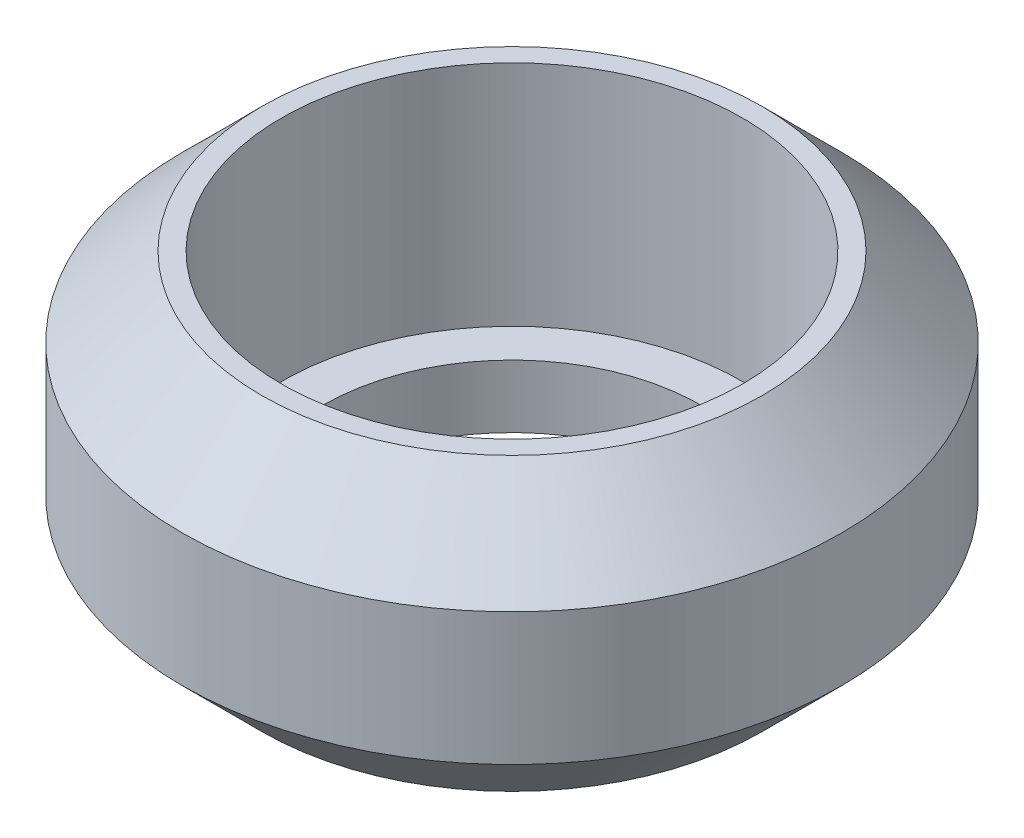
ISO-10303-21;
HEADER;
FILE_DESCRIPTION(('STEP AP214'),'2;1');
FILE_NAME('part.step','',(''),(''),'','','');
FILE_SCHEMA(('AUTOMOTIVE_DESIGN { 1 0 10303 214 1 1 1 1 }'));
ENDSEC;
DATA;
#1=APPLICATION_CONTEXT('core data for automotive mechanical design processes');
#2=APPLICATION_PROTOCOL_DEFINITION('international standard','automotive_design',2000,#1);
#3=PRODUCT_CONTEXT('',#1,'mechanical');
#4=PRODUCT('Part','Part','',(#3));
#5=PRODUCT_RELATED_PRODUCT_CATEGORY('part','',(#4));
#6=PRODUCT_DEFINITION_FORMATION('','',#4);
#7=PRODUCT_DEFINITION_CONTEXT('part definition',#1,'design');
#8=PRODUCT_DEFINITION('design','',#6,#7);
#9=PRODUCT_DEFINITION_SHAPE('','',#8);
#10=(LENGTH_UNIT() NAMED_UNIT(*) SI_UNIT(.MILLI.,.METRE.));
#11=(NAMED_UNIT(*) PLANE_ANGLE_UNIT() SI_UNIT($,.RADIAN.));
#12=(NAMED_UNIT(*) SI_UNIT($,.STERADIAN.) SOLID_ANGLE_UNIT());
#13=UNCERTAINTY_MEASURE_WITH_UNIT(LENGTH_MEASURE(1.E-05),#10,'distance_accuracy_value','');
#14=(GEOMETRIC_REPRESENTATION_CONTEXT(3) GLOBAL_UNCERTAINTY_ASSIGNED_CONTEXT((#13)) GLOBAL_UNIT_ASSIGNED_CONTEXT((#10,
#11,#12)) REPRESENTATION_CONTEXT('',''));
#15=CARTESIAN_POINT('',(0.,0.,0.));
#16=DIRECTION('',(0.,0.,1.));
#17=DIRECTION('',(1.,0.,0.));
#18=AXIS2_PLACEMENT_3D('',#15,#16,#17);
#19=CARTESIAN_POINT('',(8.8519,2.53999999999998,0.));
#20=DIRECTION('',(0.,-1.,0.));
#21=DIRECTION('',(1.,0.,0.));
#22=AXIS2_PLACEMENT_3D('',#19,#20,#21);
#23=CONICAL_SURFACE('',#22,12.6619,0.785398163397454);
#24=CARTESIAN_POINT('',(8.8519,5.588,0.));
#25=DIRECTION('',(0.,-1.,0.));
#26=DIRECTION('',(1.,0.,0.));
#27=AXIS2_PLACEMENT_3D('',#24,#25,#26);
#28=CIRCLE('',#27,9.61389999999994);
#29=CARTESIAN_POINT('',(18.4657999999999,5.588,0.));
#30=VERTEX_POINT('',#29);
#31=EDGE_CURVE('E64',#30,#30,#28,.T.);
#32=ORIENTED_EDGE('',*,*,#31,.T.);
#33=EDGE_LOOP('',(#32));
#34=FACE_BOUND('',#33,.T.);
#35=CARTESIAN_POINT('',(8.8519,2.53999999999998,0.));
#36=DIRECTION('',(0.,-1.,0.));
#37=DIRECTION('',(1.,0.,0.));
#38=AXIS2_PLACEMENT_3D('',#35,#36,#37);
#39=CIRCLE('',#38,12.6619);
#40=CARTESIAN_POINT('',(21.5138,2.53999999999998,0.));
#41=VERTEX_POINT('',#40);
#42=EDGE_CURVE('E10',#41,#41,#39,.T.);
#43=ORIENTED_EDGE('',*,*,#42,.F.);
#44=EDGE_LOOP('',(#43));
#45=FACE_BOUND('',#44,.T.);
#46=ADVANCED_FACE('F36',(#34,#45),#23,.T.);
#47=CARTESIAN_POINT('',(8.8519,-5.81002383233909,0.));
#48=DIRECTION('',(0.,-1.,0.));
#49=DIRECTION('',(1.,0.,0.));
#50=AXIS2_PLACEMENT_3D('',#47,#48,#49);
#51=CYLINDRICAL_SURFACE('',#50,12.6619);
#52=CARTESIAN_POINT('',(8.8519,-2.53999999999997,0.));
#53=DIRECTION('',(0.,-1.,0.));
#54=DIRECTION('',(1.,0.,0.));
#55=AXIS2_PLACEMENT_3D('',#52,#53,#54);
#56=CIRCLE('',#55,12.6619);
#57=CARTESIAN_POINT('',(21.5138,-2.53999999999997,0.));
#58=VERTEX_POINT('',#57);
#59=EDGE_CURVE('E42',#58,#58,#56,.T.);
#60=ORIENTED_EDGE('',*,*,#59,.F.);
#61=EDGE_LOOP('',(#60));
#62=FACE_BOUND('',#61,.T.);
#63=ORIENTED_EDGE('',*,*,#42,.T.);
#64=EDGE_LOOP('',(#63));
#65=FACE_BOUND('',#64,.T.);
#66=ADVANCED_FACE('F82',(#62,#65),#51,.T.);
#67=CARTESIAN_POINT('',(8.8519,-2.53999999999997,0.));
#68=DIRECTION('',(0.,1.,0.));
#69=DIRECTION('',(-1.,0.,0.));
#70=AXIS2_PLACEMENT_3D('',#67,#68,#69);
#71=CONICAL_SURFACE('',#70,12.6619,0.785398163397454);
#72=CARTESIAN_POINT('',(8.8519,-5.588,0.));
#73=DIRECTION('',(0.,-1.,0.));
#74=DIRECTION('',(1.,0.,0.));
#75=AXIS2_PLACEMENT_3D('',#72,#73,#74);
#76=CIRCLE('',#75,9.61389999999994);
#77=CARTESIAN_POINT('',(18.4657999999999,-5.588,0.));
#78=VERTEX_POINT('',#77);
#79=EDGE_CURVE('E46',#78,#78,#76,.T.);
#80=ORIENTED_EDGE('',*,*,#79,.F.);
#81=EDGE_LOOP('',(#80));
#82=FACE_BOUND('',#81,.T.);
#83=ORIENTED_EDGE('',*,*,#59,.T.);
#84=EDGE_LOOP('',(#83));
#85=FACE_BOUND('',#84,.T.);
#86=ADVANCED_FACE('F86',(#82,#85),#71,.T.);
#87=CARTESIAN_POINT('',(0.,-5.588,0.));
#88=DIRECTION('',(0.,1.,0.));
#89=DIRECTION('',(-1.,0.,0.));
#90=AXIS2_PLACEMENT_3D('',#87,#88,#89);
#91=PLANE('',#90);
#92=CARTESIAN_POINT('',(8.8519,-5.588,0.));
#93=DIRECTION('',(0.,-1.,0.));
#94=DIRECTION('',(1.,0.,0.));
#95=AXIS2_PLACEMENT_3D('',#92,#93,#94);
#96=CIRCLE('',#95,7.2644);
#97=CARTESIAN_POINT('',(16.1163,-5.588,0.));
#98=VERTEX_POINT('',#97);
#99=EDGE_CURVE('E50',#98,#98,#96,.T.);
#100=ORIENTED_EDGE('',*,*,#99,.F.);
#101=EDGE_LOOP('',(#100));
#102=FACE_BOUND('',#101,.T.);
#103=ORIENTED_EDGE('',*,*,#79,.T.);
#104=EDGE_LOOP('',(#103));
#105=FACE_BOUND('',#104,.T.);
#106=ADVANCED_FACE('F91',(#102,#105),#91,.F.);
#107=CARTESIAN_POINT('',(8.8519,-5.81002383233909,0.));
#108=DIRECTION('',(0.,-1.,0.));
#109=DIRECTION('',(1.,0.,0.));
#110=AXIS2_PLACEMENT_3D('',#107,#108,#109);
#111=CYLINDRICAL_SURFACE('',#110,7.2644);
#112=CARTESIAN_POINT('',(8.8519,-3.175,0.));
#113=DIRECTION('',(0.,-1.,0.));
#114=DIRECTION('',(1.,0.,0.));
#115=AXIS2_PLACEMENT_3D('',#112,#113,#114);
#116=CIRCLE('',#115,7.2644);
#117=CARTESIAN_POINT('',(16.1163,-3.175,0.));
#118=VERTEX_POINT('',#117);
#119=EDGE_CURVE('E55',#118,#118,#116,.T.);
#120=ORIENTED_EDGE('',*,*,#119,.F.);
#121=EDGE_LOOP('',(#120));
#122=FACE_BOUND('',#121,.T.);
#123=ORIENTED_EDGE('',*,*,#99,.T.);
#124=EDGE_LOOP('',(#123));
#125=FACE_BOUND('',#124,.T.);
#126=ADVANCED_FACE('F97',(#122,#125),#111,.F.);
#127=CARTESIAN_POINT('',(0.,-3.175,0.));
#128=DIRECTION('',(0.,-1.,0.));
#129=DIRECTION('',(1.,0.,0.));
#130=AXIS2_PLACEMENT_3D('',#127,#128,#129);
#131=PLANE('',#130);
#132=CARTESIAN_POINT('',(8.8519,-3.175,0.));
#133=DIRECTION('',(0.,-1.,0.));
#134=DIRECTION('',(1.,0.,0.));
#135=AXIS2_PLACEMENT_3D('',#132,#133,#134);
#136=CIRCLE('',#135,8.8519);
#137=CARTESIAN_POINT('',(17.7038,-3.175,0.));
#138=VERTEX_POINT('',#137);
#139=EDGE_CURVE('E58',#138,#138,#136,.T.);
#140=ORIENTED_EDGE('',*,*,#139,.F.);
#141=EDGE_LOOP('',(#140));
#142=FACE_BOUND('',#141,.T.);
#143=ORIENTED_EDGE('',*,*,#119,.T.);
#144=EDGE_LOOP('',(#143));
#145=FACE_BOUND('',#144,.T.);
#146=ADVANCED_FACE('F78',(#142,#145),#131,.F.);
#147=CARTESIAN_POINT('',(8.8519,-5.81002383233909,0.));
#148=DIRECTION('',(0.,-1.,0.));
#149=DIRECTION('',(1.,0.,0.));
#150=AXIS2_PLACEMENT_3D('',#147,#148,#149);
#151=CYLINDRICAL_SURFACE('',#150,8.8519);
#152=CARTESIAN_POINT('',(8.8519,5.588,0.));
#153=DIRECTION('',(0.,-1.,0.));
#154=DIRECTION('',(1.,0.,0.));
#155=AXIS2_PLACEMENT_3D('',#152,#153,#154);
#156=CIRCLE('',#155,8.8519);
#157=CARTESIAN_POINT('',(17.7038,5.588,0.));
#158=VERTEX_POINT('',#157);
#159=EDGE_CURVE('E61',#158,#158,#156,.T.);
#160=ORIENTED_EDGE('',*,*,#159,.F.);
#161=EDGE_LOOP('',(#160));
#162=FACE_BOUND('',#161,.T.);
#163=ORIENTED_EDGE('',*,*,#139,.T.);
#164=EDGE_LOOP('',(#163));
#165=FACE_BOUND('',#164,.T.);
#166=ADVANCED_FACE('F72',(#162,#165),#151,.F.);
#167=CARTESIAN_POINT('',(0.,5.588,0.));
#168=DIRECTION('',(0.,1.,0.));
#169=DIRECTION('',(-1.,0.,0.));
#170=AXIS2_PLACEMENT_3D('',#167,#168,#169);
#171=PLANE('',#170);
#172=ORIENTED_EDGE('',*,*,#159,.T.);
#173=EDGE_LOOP('',(#172));
#174=FACE_BOUND('',#173,.T.);
#175=ORIENTED_EDGE('',*,*,#31,.F.);
#176=EDGE_LOOP('',(#175));
#177=FACE_BOUND('',#176,.T.);
#178=ADVANCED_FACE('F70',(#174,#177),#171,.T.);
#179=CLOSED_SHELL('',(#46,#66,#86,#106,#126,#146,#166,#178));
#180=MANIFOLD_SOLID_BREP('B2',#179);
#181=ADVANCED_BREP_SHAPE_REPRESENTATION('',(#18,#180),#14);
#182=SHAPE_DEFINITION_REPRESENTATION(#9,#181);
ENDSEC;
END-ISO-10303-21;
